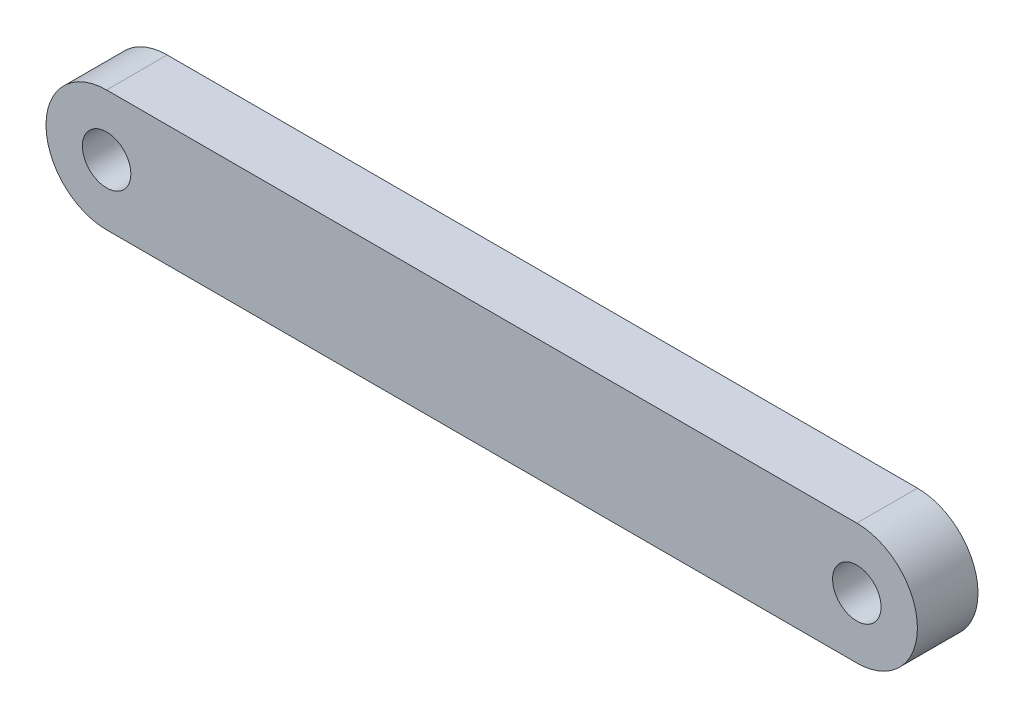
ISO-10303-21;
HEADER;
FILE_DESCRIPTION(('STEP AP214'),'2;1');
FILE_NAME('part.step','',(''),(''),'','','');
FILE_SCHEMA(('AUTOMOTIVE_DESIGN { 1 0 10303 214 1 1 1 1 }'));
ENDSEC;
DATA;
#1=APPLICATION_CONTEXT('core data for automotive mechanical design processes');
#2=APPLICATION_PROTOCOL_DEFINITION('international standard','automotive_design',2000,#1);
#3=PRODUCT_CONTEXT('',#1,'mechanical');
#4=PRODUCT('Part','Part','',(#3));
#5=PRODUCT_RELATED_PRODUCT_CATEGORY('part','',(#4));
#6=PRODUCT_DEFINITION_FORMATION('','',#4);
#7=PRODUCT_DEFINITION_CONTEXT('part definition',#1,'design');
#8=PRODUCT_DEFINITION('design','',#6,#7);
#9=PRODUCT_DEFINITION_SHAPE('','',#8);
#10=(LENGTH_UNIT() NAMED_UNIT(*) SI_UNIT(.MILLI.,.METRE.));
#11=(NAMED_UNIT(*) PLANE_ANGLE_UNIT() SI_UNIT($,.RADIAN.));
#12=(NAMED_UNIT(*) SI_UNIT($,.STERADIAN.) SOLID_ANGLE_UNIT());
#13=UNCERTAINTY_MEASURE_WITH_UNIT(LENGTH_MEASURE(1.E-05),#10,'distance_accuracy_value','');
#14=(GEOMETRIC_REPRESENTATION_CONTEXT(3) GLOBAL_UNCERTAINTY_ASSIGNED_CONTEXT((#13)) GLOBAL_UNIT_ASSIGNED_CONTEXT((#10,
#11,#12)) REPRESENTATION_CONTEXT('',''));
#15=CARTESIAN_POINT('',(0.,0.,0.));
#16=DIRECTION('',(0.,0.,1.));
#17=DIRECTION('',(1.,0.,0.));
#18=AXIS2_PLACEMENT_3D('',#15,#16,#17);
#19=CARTESIAN_POINT('',(-30.95,0.,2.5));
#20=DIRECTION('',(0.,0.,1.));
#21=DIRECTION('',(1.,0.,0.));
#22=AXIS2_PLACEMENT_3D('',#19,#20,#21);
#23=PLANE('',#22);
#24=CARTESIAN_POINT('',(30.95,0.,2.5));
#25=DIRECTION('',(0.,0.,1.));
#26=DIRECTION('',(1.,0.,0.));
#27=AXIS2_PLACEMENT_3D('',#24,#25,#26);
#28=CIRCLE('',#27,2.);
#29=CARTESIAN_POINT('',(32.95,0.,2.5));
#30=VERTEX_POINT('',#29);
#31=EDGE_CURVE('E112',#30,#30,#28,.T.);
#32=ORIENTED_EDGE('',*,*,#31,.F.);
#33=EDGE_LOOP('',(#32));
#34=FACE_BOUND('',#33,.T.);
#35=CARTESIAN_POINT('',(-30.95,0.,2.5));
#36=DIRECTION('',(0.,0.,1.));
#37=DIRECTION('',(1.,0.,0.));
#38=AXIS2_PLACEMENT_3D('',#35,#36,#37);
#39=CIRCLE('',#38,5.);
#40=CARTESIAN_POINT('',(-30.95,5.,2.5));
#41=VERTEX_POINT('',#40);
#42=CARTESIAN_POINT('',(-30.95,-5.,2.5));
#43=VERTEX_POINT('',#42);
#44=EDGE_CURVE('E92',#41,#43,#39,.T.);
#45=ORIENTED_EDGE('',*,*,#44,.T.);
#46=DIRECTION('',(1.,0.,0.));
#47=VECTOR('',#46,1.);
#48=CARTESIAN_POINT('',(-30.95,-5.,2.5));
#49=LINE('',#48,#47);
#50=CARTESIAN_POINT('',(30.95,-4.99999999999999,2.5));
#51=VERTEX_POINT('',#50);
#52=EDGE_CURVE('E87',#43,#51,#49,.T.);
#53=ORIENTED_EDGE('',*,*,#52,.T.);
#54=CARTESIAN_POINT('',(30.95,0.,2.5));
#55=DIRECTION('',(0.,0.,1.));
#56=DIRECTION('',(1.,0.,0.));
#57=AXIS2_PLACEMENT_3D('',#54,#55,#56);
#58=CIRCLE('',#57,5.);
#59=CARTESIAN_POINT('',(30.95,5.00000000000001,2.5));
#60=VERTEX_POINT('',#59);
#61=EDGE_CURVE('E90',#51,#60,#58,.T.);
#62=ORIENTED_EDGE('',*,*,#61,.T.);
#63=DIRECTION('',(-1.,0.,0.));
#64=VECTOR('',#63,1.);
#65=CARTESIAN_POINT('',(-30.95,5.,2.5));
#66=LINE('',#65,#64);
#67=EDGE_CURVE('E57',#60,#41,#66,.T.);
#68=ORIENTED_EDGE('',*,*,#67,.T.);
#69=EDGE_LOOP('',(#45,#53,#62,#68));
#70=FACE_BOUND('',#69,.T.);
#71=CARTESIAN_POINT('',(-30.95,0.,2.5));
#72=DIRECTION('',(0.,0.,1.));
#73=DIRECTION('',(1.,0.,0.));
#74=AXIS2_PLACEMENT_3D('',#71,#72,#73);
#75=CIRCLE('',#74,2.);
#76=CARTESIAN_POINT('',(-28.95,0.,2.5));
#77=VERTEX_POINT('',#76);
#78=EDGE_CURVE('E134',#77,#77,#75,.T.);
#79=ORIENTED_EDGE('',*,*,#78,.F.);
#80=EDGE_LOOP('',(#79));
#81=FACE_BOUND('',#80,.T.);
#82=ADVANCED_FACE('F39',(#34,#70,#81),#23,.T.);
#83=CARTESIAN_POINT('',(-30.95,0.,-2.5));
#84=DIRECTION('',(0.,0.,1.));
#85=DIRECTION('',(1.,0.,0.));
#86=AXIS2_PLACEMENT_3D('',#83,#84,#85);
#87=PLANE('',#86);
#88=CARTESIAN_POINT('',(-30.95,0.,-2.5));
#89=DIRECTION('',(0.,0.,1.));
#90=DIRECTION('',(1.,0.,0.));
#91=AXIS2_PLACEMENT_3D('',#88,#89,#90);
#92=CIRCLE('',#91,5.);
#93=CARTESIAN_POINT('',(-30.95,5.,-2.5));
#94=VERTEX_POINT('',#93);
#95=CARTESIAN_POINT('',(-30.95,-5.,-2.5));
#96=VERTEX_POINT('',#95);
#97=EDGE_CURVE('E108',#94,#96,#92,.T.);
#98=ORIENTED_EDGE('',*,*,#97,.F.);
#99=DIRECTION('',(-1.,0.,0.));
#100=VECTOR('',#99,1.);
#101=CARTESIAN_POINT('',(-30.95,5.,-2.5));
#102=LINE('',#101,#100);
#103=CARTESIAN_POINT('',(30.95,5.00000000000001,-2.5));
#104=VERTEX_POINT('',#103);
#105=EDGE_CURVE('E80',#104,#94,#102,.T.);
#106=ORIENTED_EDGE('',*,*,#105,.F.);
#107=CARTESIAN_POINT('',(30.95,0.,-2.5));
#108=DIRECTION('',(0.,0.,1.));
#109=DIRECTION('',(1.,0.,0.));
#110=AXIS2_PLACEMENT_3D('',#107,#108,#109);
#111=CIRCLE('',#110,5.);
#112=CARTESIAN_POINT('',(30.95,-4.99999999999999,-2.5));
#113=VERTEX_POINT('',#112);
#114=EDGE_CURVE('E74',#113,#104,#111,.T.);
#115=ORIENTED_EDGE('',*,*,#114,.F.);
#116=DIRECTION('',(1.,0.,0.));
#117=VECTOR('',#116,1.);
#118=CARTESIAN_POINT('',(-30.95,-5.,-2.5));
#119=LINE('',#118,#117);
#120=EDGE_CURVE('E97',#96,#113,#119,.T.);
#121=ORIENTED_EDGE('',*,*,#120,.F.);
#122=EDGE_LOOP('',(#98,#106,#115,#121));
#123=FACE_BOUND('',#122,.T.);
#124=CARTESIAN_POINT('',(30.95,0.,-2.5));
#125=DIRECTION('',(0.,0.,1.));
#126=DIRECTION('',(1.,0.,0.));
#127=AXIS2_PLACEMENT_3D('',#124,#125,#126);
#128=CIRCLE('',#127,2.);
#129=CARTESIAN_POINT('',(32.95,0.,-2.5));
#130=VERTEX_POINT('',#129);
#131=EDGE_CURVE('E130',#130,#130,#128,.T.);
#132=ORIENTED_EDGE('',*,*,#131,.T.);
#133=EDGE_LOOP('',(#132));
#134=FACE_BOUND('',#133,.T.);
#135=CARTESIAN_POINT('',(-30.95,0.,-2.5));
#136=DIRECTION('',(0.,0.,1.));
#137=DIRECTION('',(1.,0.,0.));
#138=AXIS2_PLACEMENT_3D('',#135,#136,#137);
#139=CIRCLE('',#138,2.);
#140=CARTESIAN_POINT('',(-28.95,0.,-2.5));
#141=VERTEX_POINT('',#140);
#142=EDGE_CURVE('E138',#141,#141,#139,.T.);
#143=ORIENTED_EDGE('',*,*,#142,.T.);
#144=EDGE_LOOP('',(#143));
#145=FACE_BOUND('',#144,.T.);
#146=ADVANCED_FACE('F125',(#123,#134,#145),#87,.F.);
#147=CARTESIAN_POINT('',(-30.95,0.,2.5));
#148=DIRECTION('',(0.,0.,-1.));
#149=DIRECTION('',(-1.,0.,0.));
#150=AXIS2_PLACEMENT_3D('',#147,#148,#149);
#151=CYLINDRICAL_SURFACE('',#150,5.);
#152=ORIENTED_EDGE('',*,*,#97,.T.);
#153=DIRECTION('',(0.,0.,-1.));
#154=VECTOR('',#153,1.);
#155=CARTESIAN_POINT('',(-30.95,-5.,2.5));
#156=LINE('',#155,#154);
#157=EDGE_CURVE('E11',#43,#96,#156,.T.);
#158=ORIENTED_EDGE('',*,*,#157,.F.);
#159=ORIENTED_EDGE('',*,*,#44,.F.);
#160=DIRECTION('',(0.,0.,-1.));
#161=VECTOR('',#160,1.);
#162=CARTESIAN_POINT('',(-30.95,5.,2.5));
#163=LINE('',#162,#161);
#164=EDGE_CURVE('E104',#41,#94,#163,.T.);
#165=ORIENTED_EDGE('',*,*,#164,.T.);
#166=EDGE_LOOP('',(#152,#158,#159,#165));
#167=FACE_BOUND('',#166,.T.);
#168=ADVANCED_FACE('F41',(#167),#151,.T.);
#169=CARTESIAN_POINT('',(-30.95,-5.,2.5));
#170=DIRECTION('',(0.,1.,0.));
#171=DIRECTION('',(-1.,0.,0.));
#172=AXIS2_PLACEMENT_3D('',#169,#170,#171);
#173=PLANE('',#172);
#174=ORIENTED_EDGE('',*,*,#120,.T.);
#175=DIRECTION('',(0.,0.,-1.));
#176=VECTOR('',#175,1.);
#177=CARTESIAN_POINT('',(30.95,-4.99999999999999,2.5));
#178=LINE('',#177,#176);
#179=EDGE_CURVE('E49',#51,#113,#178,.T.);
#180=ORIENTED_EDGE('',*,*,#179,.F.);
#181=ORIENTED_EDGE('',*,*,#52,.F.);
#182=ORIENTED_EDGE('',*,*,#157,.T.);
#183=EDGE_LOOP('',(#174,#180,#181,#182));
#184=FACE_BOUND('',#183,.T.);
#185=ADVANCED_FACE('F96',(#184),#173,.F.);
#186=CARTESIAN_POINT('',(30.95,0.,2.5));
#187=DIRECTION('',(0.,0.,-1.));
#188=DIRECTION('',(-1.,0.,0.));
#189=AXIS2_PLACEMENT_3D('',#186,#187,#188);
#190=CYLINDRICAL_SURFACE('',#189,5.);
#191=ORIENTED_EDGE('',*,*,#114,.T.);
#192=DIRECTION('',(0.,0.,-1.));
#193=VECTOR('',#192,1.);
#194=CARTESIAN_POINT('',(30.95,5.00000000000001,2.5));
#195=LINE('',#194,#193);
#196=EDGE_CURVE('E99',#60,#104,#195,.T.);
#197=ORIENTED_EDGE('',*,*,#196,.F.);
#198=ORIENTED_EDGE('',*,*,#61,.F.);
#199=ORIENTED_EDGE('',*,*,#179,.T.);
#200=EDGE_LOOP('',(#191,#197,#198,#199));
#201=FACE_BOUND('',#200,.T.);
#202=ADVANCED_FACE('F100',(#201),#190,.T.);
#203=CARTESIAN_POINT('',(-30.95,5.,2.5));
#204=DIRECTION('',(0.,-1.,0.));
#205=DIRECTION('',(1.,0.,0.));
#206=AXIS2_PLACEMENT_3D('',#203,#204,#205);
#207=PLANE('',#206);
#208=ORIENTED_EDGE('',*,*,#105,.T.);
#209=ORIENTED_EDGE('',*,*,#164,.F.);
#210=ORIENTED_EDGE('',*,*,#67,.F.);
#211=ORIENTED_EDGE('',*,*,#196,.T.);
#212=EDGE_LOOP('',(#208,#209,#210,#211));
#213=FACE_BOUND('',#212,.T.);
#214=ADVANCED_FACE('F122',(#213),#207,.F.);
#215=CARTESIAN_POINT('',(30.95,0.,2.5));
#216=DIRECTION('',(0.,0.,-1.));
#217=DIRECTION('',(-1.,0.,0.));
#218=AXIS2_PLACEMENT_3D('',#215,#216,#217);
#219=CYLINDRICAL_SURFACE('',#218,2.);
#220=ORIENTED_EDGE('',*,*,#31,.T.);
#221=EDGE_LOOP('',(#220));
#222=FACE_BOUND('',#221,.T.);
#223=ORIENTED_EDGE('',*,*,#131,.F.);
#224=EDGE_LOOP('',(#223));
#225=FACE_BOUND('',#224,.T.);
#226=ADVANCED_FACE('F157',(#222,#225),#219,.F.);
#227=CARTESIAN_POINT('',(-30.95,0.,2.5));
#228=DIRECTION('',(0.,0.,-1.));
#229=DIRECTION('',(-1.,0.,0.));
#230=AXIS2_PLACEMENT_3D('',#227,#228,#229);
#231=CYLINDRICAL_SURFACE('',#230,2.);
#232=ORIENTED_EDGE('',*,*,#78,.T.);
#233=EDGE_LOOP('',(#232));
#234=FACE_BOUND('',#233,.T.);
#235=ORIENTED_EDGE('',*,*,#142,.F.);
#236=EDGE_LOOP('',(#235));
#237=FACE_BOUND('',#236,.T.);
#238=ADVANCED_FACE('F146',(#234,#237),#231,.F.);
#239=CLOSED_SHELL('',(#82,#146,#168,#185,#202,#214,#226,#238));
#240=MANIFOLD_SOLID_BREP('B2',#239);
#241=ADVANCED_BREP_SHAPE_REPRESENTATION('',(#18,#240),#14);
#242=SHAPE_DEFINITION_REPRESENTATION(#9,#241);
ENDSEC;
END-ISO-10303-21;
